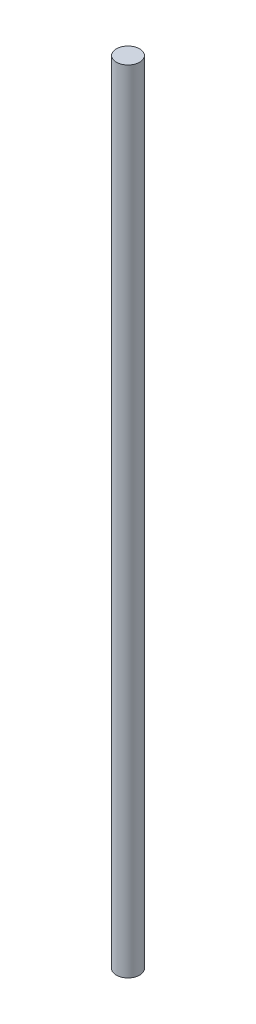
ISO-10303-21;
HEADER;
FILE_DESCRIPTION(('STEP AP214'),'2;1');
FILE_NAME('part.step','',(''),(''),'','','');
FILE_SCHEMA(('AUTOMOTIVE_DESIGN { 1 0 10303 214 1 1 1 1 }'));
ENDSEC;
DATA;
#1=APPLICATION_CONTEXT('core data for automotive mechanical design processes');
#2=APPLICATION_PROTOCOL_DEFINITION('international standard','automotive_design',2000,#1);
#3=PRODUCT_CONTEXT('',#1,'mechanical');
#4=PRODUCT('Part','Part','',(#3));
#5=PRODUCT_RELATED_PRODUCT_CATEGORY('part','',(#4));
#6=PRODUCT_DEFINITION_FORMATION('','',#4);
#7=PRODUCT_DEFINITION_CONTEXT('part definition',#1,'design');
#8=PRODUCT_DEFINITION('design','',#6,#7);
#9=PRODUCT_DEFINITION_SHAPE('','',#8);
#10=(LENGTH_UNIT() NAMED_UNIT(*) SI_UNIT(.MILLI.,.METRE.));
#11=(NAMED_UNIT(*) PLANE_ANGLE_UNIT() SI_UNIT($,.RADIAN.));
#12=(NAMED_UNIT(*) SI_UNIT($,.STERADIAN.) SOLID_ANGLE_UNIT());
#13=UNCERTAINTY_MEASURE_WITH_UNIT(LENGTH_MEASURE(1.E-05),#10,'distance_accuracy_value','');
#14=(GEOMETRIC_REPRESENTATION_CONTEXT(3) GLOBAL_UNCERTAINTY_ASSIGNED_CONTEXT((#13)) GLOBAL_UNIT_ASSIGNED_CONTEXT((#10,
#11,#12)) REPRESENTATION_CONTEXT('',''));
#15=CARTESIAN_POINT('',(0.,0.,0.));
#16=DIRECTION('',(0.,0.,1.));
#17=DIRECTION('',(1.,0.,0.));
#18=AXIS2_PLACEMENT_3D('',#15,#16,#17);
#19=CARTESIAN_POINT('',(0.,170.,0.));
#20=DIRECTION('',(0.,-1.,0.));
#21=DIRECTION('',(0.,0.,-1.));
#22=AXIS2_PLACEMENT_3D('',#19,#20,#21);
#23=CYLINDRICAL_SURFACE('',#22,2.5);
#24=CARTESIAN_POINT('',(0.,170.,0.));
#25=DIRECTION('',(0.,1.,0.));
#26=DIRECTION('',(0.,0.,1.));
#27=AXIS2_PLACEMENT_3D('',#24,#25,#26);
#28=CIRCLE('',#27,2.5);
#29=CARTESIAN_POINT('',(0.,170.,2.5));
#30=VERTEX_POINT('',#29);
#31=EDGE_CURVE('E10',#30,#30,#28,.T.);
#32=ORIENTED_EDGE('',*,*,#31,.F.);
#33=EDGE_LOOP('',(#32));
#34=FACE_BOUND('',#33,.T.);
#35=CARTESIAN_POINT('',(0.,0.,0.));
#36=DIRECTION('',(0.,1.,0.));
#37=DIRECTION('',(0.,0.,1.));
#38=AXIS2_PLACEMENT_3D('',#35,#36,#37);
#39=CIRCLE('',#38,2.5);
#40=CARTESIAN_POINT('',(0.,0.,2.5));
#41=VERTEX_POINT('',#40);
#42=EDGE_CURVE('E37',#41,#41,#39,.T.);
#43=ORIENTED_EDGE('',*,*,#42,.T.);
#44=EDGE_LOOP('',(#43));
#45=FACE_BOUND('',#44,.T.);
#46=ADVANCED_FACE('F34',(#34,#45),#23,.T.);
#47=CARTESIAN_POINT('',(0.,170.,0.));
#48=DIRECTION('',(0.,1.,0.));
#49=DIRECTION('',(0.,0.,1.));
#50=AXIS2_PLACEMENT_3D('',#47,#48,#49);
#51=PLANE('',#50);
#52=ORIENTED_EDGE('',*,*,#31,.T.);
#53=EDGE_LOOP('',(#52));
#54=FACE_BOUND('',#53,.T.);
#55=ADVANCED_FACE('F49',(#54),#51,.T.);
#56=CARTESIAN_POINT('',(0.,0.,0.));
#57=DIRECTION('',(0.,1.,0.));
#58=DIRECTION('',(0.,0.,1.));
#59=AXIS2_PLACEMENT_3D('',#56,#57,#58);
#60=PLANE('',#59);
#61=ORIENTED_EDGE('',*,*,#42,.F.);
#62=EDGE_LOOP('',(#61));
#63=FACE_BOUND('',#62,.T.);
#64=ADVANCED_FACE('F47',(#63),#60,.F.);
#65=CLOSED_SHELL('',(#46,#55,#64));
#66=MANIFOLD_SOLID_BREP('B2',#65);
#67=ADVANCED_BREP_SHAPE_REPRESENTATION('',(#18,#66),#14);
#68=SHAPE_DEFINITION_REPRESENTATION(#9,#67);
ENDSEC;
END-ISO-10303-21;
